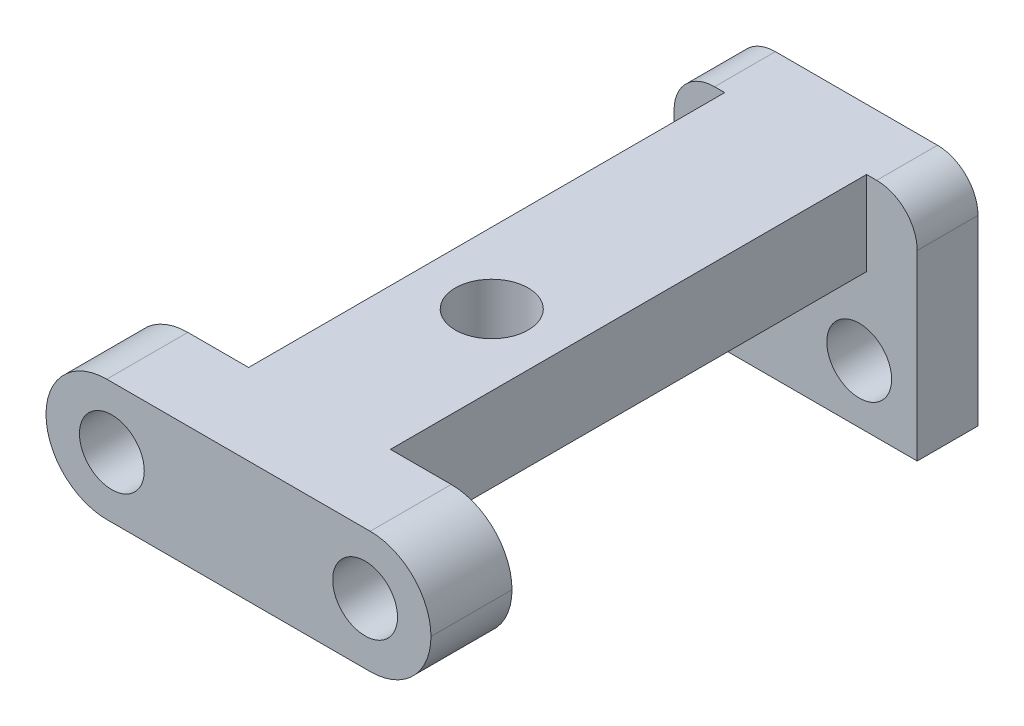
ISO-10303-21;
HEADER;
FILE_DESCRIPTION(('STEP AP214'),'2;1');
FILE_NAME('part.step','',(''),(''),'','','');
FILE_SCHEMA(('AUTOMOTIVE_DESIGN { 1 0 10303 214 1 1 1 1 }'));
ENDSEC;
DATA;
#1=APPLICATION_CONTEXT('core data for automotive mechanical design processes');
#2=APPLICATION_PROTOCOL_DEFINITION('international standard','automotive_design',2000,#1);
#3=PRODUCT_CONTEXT('',#1,'mechanical');
#4=PRODUCT('Part','Part','',(#3));
#5=PRODUCT_RELATED_PRODUCT_CATEGORY('part','',(#4));
#6=PRODUCT_DEFINITION_FORMATION('','',#4);
#7=PRODUCT_DEFINITION_CONTEXT('part definition',#1,'design');
#8=PRODUCT_DEFINITION('design','',#6,#7);
#9=PRODUCT_DEFINITION_SHAPE('','',#8);
#10=(LENGTH_UNIT() NAMED_UNIT(*) SI_UNIT(.MILLI.,.METRE.));
#11=(NAMED_UNIT(*) PLANE_ANGLE_UNIT() SI_UNIT($,.RADIAN.));
#12=(NAMED_UNIT(*) SI_UNIT($,.STERADIAN.) SOLID_ANGLE_UNIT());
#13=UNCERTAINTY_MEASURE_WITH_UNIT(LENGTH_MEASURE(1.E-05),#10,'distance_accuracy_value','');
#14=(GEOMETRIC_REPRESENTATION_CONTEXT(3) GLOBAL_UNCERTAINTY_ASSIGNED_CONTEXT((#13)) GLOBAL_UNIT_ASSIGNED_CONTEXT((#10,
#11,#12)) REPRESENTATION_CONTEXT('',''));
#15=CARTESIAN_POINT('',(0.,0.,0.));
#16=DIRECTION('',(0.,0.,1.));
#17=DIRECTION('',(1.,0.,0.));
#18=AXIS2_PLACEMENT_3D('',#15,#16,#17);
#19=CARTESIAN_POINT('',(0.,0.,27.5));
#20=DIRECTION('',(0.,0.,-1.));
#21=DIRECTION('',(-1.,0.,0.));
#22=AXIS2_PLACEMENT_3D('',#19,#20,#21);
#23=CYLINDRICAL_SURFACE('',#22,40.);
#24=CARTESIAN_POINT('',(0.,40.,16.8));
#25=CARTESIAN_POINT('',(-0.101051914719797,39.999999457016,16.7999955359726));
#26=CARTESIAN_POINT('',(-0.202175798413311,39.9996129659403,16.7914618501219));
#27=CARTESIAN_POINT('',(-0.401634798514854,39.9981083318101,16.7575398127747));
#28=CARTESIAN_POINT('',(-0.499966471947186,39.996989323187,16.7321315211301));
#29=CARTESIAN_POINT('',(-0.690922772210576,39.9941463282659,16.6651884248385));
#30=CARTESIAN_POINT('',(-0.783550245788738,39.9924226466609,16.6236617410828));
#31=CARTESIAN_POINT('',(-0.960494305476466,39.9885645227784,16.5256728875248));
#32=CARTESIAN_POINT('',(-1.04481286673066,39.9864301784791,16.4692142790626));
#33=CARTESIAN_POINT('',(-1.20284227269959,39.9819888780099,16.3429106077246));
#34=CARTESIAN_POINT('',(-1.27654526473791,39.9796817959582,16.2730557233464));
#35=CARTESIAN_POINT('',(-1.41118459720699,39.9751561327293,16.1219616438645));
#36=CARTESIAN_POINT('',(-1.47212042005941,39.9729375551431,16.0407219874474));
#37=CARTESIAN_POINT('',(-1.57951582618927,39.9688382334278,15.869125185014));
#38=CARTESIAN_POINT('',(-1.62596950488977,39.9669576272266,15.7787643399834));
#39=CARTESIAN_POINT('',(-1.70304402326993,39.963747792788,15.591516262423));
#40=CARTESIAN_POINT('',(-1.73366496624174,39.9624185609535,15.4946290724754));
#41=CARTESIAN_POINT('',(-1.77818466726212,39.9604624691031,15.2971487729222));
#42=CARTESIAN_POINT('',(-1.79209484484824,39.9598351294595,15.1965582425489));
#43=CARTESIAN_POINT('',(-1.80283338005946,39.9593521228803,14.9944680848602));
#44=CARTESIAN_POINT('',(-1.79966185269654,39.959496450749,14.8929684636705));
#45=CARTESIAN_POINT('',(-1.77633654044452,39.9605400576052,14.6920188889247));
#46=CARTESIAN_POINT('',(-1.75619509042125,39.9614387882409,14.5925675003516));
#47=CARTESIAN_POINT('',(-1.69952078232798,39.9638890360555,14.3984588593437));
#48=CARTESIAN_POINT('',(-1.66298786481739,39.9654405556016,14.3038016242955));
#49=CARTESIAN_POINT('',(-1.57455354522525,39.9690221348509,14.1219285069495));
#50=CARTESIAN_POINT('',(-1.52264651025507,39.9710523698939,14.0347153671905));
#51=CARTESIAN_POINT('',(-1.40494152334163,39.9753623609457,13.8702361117621));
#52=CARTESIAN_POINT('',(-1.33914349303119,39.9776421183622,13.7929700522138));
#53=CARTESIAN_POINT('',(-1.19545462518403,39.9821966281058,13.6505064515006));
#54=CARTESIAN_POINT('',(-1.11755310311077,39.9844713741921,13.5853196860778));
#55=CARTESIAN_POINT('',(-0.951906176697614,39.9887575108181,13.4689480977805));
#56=CARTESIAN_POINT('',(-0.864160770218331,39.9907689013005,13.417763277949));
#57=CARTESIAN_POINT('',(-0.68131062802147,39.9943016941348,13.3308496092599));
#58=CARTESIAN_POINT('',(-0.586205718526382,39.995823084912,13.295121125499));
#59=CARTESIAN_POINT('',(-0.391339011752936,39.9982042315168,13.2401413230687));
#60=CARTESIAN_POINT('',(-0.291577242751363,39.9990639913611,13.2208899043631));
#61=CARTESIAN_POINT('',(-0.0903222591607367,40.0000244583365,13.1994239671856));
#62=CARTESIAN_POINT('',(0.0111693624451952,40.0001258296116,13.1971945419987));
#63=CARTESIAN_POINT('',(0.213085316249135,39.9995598562656,13.2097969916761));
#64=CARTESIAN_POINT('',(0.313509651294398,39.9988925136958,13.2246288210137));
#65=CARTESIAN_POINT('',(0.51039865003854,39.9968647182223,13.2709204213613));
#66=CARTESIAN_POINT('',(0.606864914556497,39.9955045485747,13.3023733971616));
#67=CARTESIAN_POINT('',(0.793148719896412,39.9922442747655,13.381007567835));
#68=CARTESIAN_POINT('',(0.882966229794925,39.9903441680928,13.4281888358548));
#69=CARTESIAN_POINT('',(1.05347143760494,39.9862162054273,13.5369785221013));
#70=CARTESIAN_POINT('',(1.13415274653935,39.9839881225533,13.5985969449874));
#71=CARTESIAN_POINT('',(1.2840310900569,39.9794559437157,13.7344971825781));
#72=CARTESIAN_POINT('',(1.35322806417522,39.9771518473521,13.8087790639513));
#73=CARTESIAN_POINT('',(1.47822356315217,39.9727254615055,13.9679616872846));
#74=CARTESIAN_POINT('',(1.53401245170323,39.9706033034809,14.0528700001431));
#75=CARTESIAN_POINT('',(1.63054228552971,39.9667821511794,14.230856911139));
#76=CARTESIAN_POINT('',(1.67128328697316,39.965083155323,14.3239354787784));
#77=CARTESIAN_POINT('',(1.73654402350732,39.9623008442568,14.5155848688947));
#78=CARTESIAN_POINT('',(1.76106992850842,39.9612172948893,14.6141535868499));
#79=CARTESIAN_POINT('',(1.79322446244897,39.9597873997389,14.8140148099575));
#80=CARTESIAN_POINT('',(1.80085316318999,39.9594410508234,14.9153073035338));
#81=CARTESIAN_POINT('',(1.79899602386849,39.9595246946806,15.1176447576157));
#82=CARTESIAN_POINT('',(1.78952534925552,39.9599539995255,15.2186898579528));
#83=CARTESIAN_POINT('',(1.75376960904838,39.9615391099764,15.4177540425272));
#84=CARTESIAN_POINT('',(1.72748451096948,39.962694916986,15.5157731209178));
#85=CARTESIAN_POINT('',(1.65884899681329,39.9656026088208,15.7060064721643));
#86=CARTESIAN_POINT('',(1.61649840541597,39.967354500151,15.7982206816598));
#87=CARTESIAN_POINT('',(1.51693704719745,39.9712568355617,15.9742302384845));
#88=CARTESIAN_POINT('',(1.45972676043274,39.9734072667663,16.0580258576629));
#89=CARTESIAN_POINT('',(1.33201693457347,39.9778664386974,16.2148945431379));
#90=CARTESIAN_POINT('',(1.26150708482,39.9801753013604,16.2879592114304));
#91=CARTESIAN_POINT('',(1.10920151908198,39.9846903629391,16.4212363730933));
#92=CARTESIAN_POINT('',(1.02740302565458,39.98689653641,16.4814456942365));
#93=CARTESIAN_POINT('',(0.854787564323086,39.9909588898273,16.5873258186714));
#94=CARTESIAN_POINT('',(0.763962853833083,39.9928147652666,16.6329839964611));
#95=CARTESIAN_POINT('',(0.575997093234725,39.9959626189959,16.7083491777296));
#96=CARTESIAN_POINT('',(0.478863678791842,39.9972552648908,16.7380750756629));
#97=CARTESIAN_POINT('',(0.317603112098561,39.9987880385604,16.7729107767247));
#98=CARTESIAN_POINT('',(0.254521149372205,39.9992405342942,16.7830563219923));
#99=CARTESIAN_POINT('',(0.127635696366364,39.9998466864074,16.7966023412402));
#100=CARTESIAN_POINT('',(0.0638322065794623,40.0000003429907,16.800002819825));
#101=CARTESIAN_POINT('',(0.,40.,16.8));
#102=B_SPLINE_CURVE_WITH_KNOTS('',3,(#24,#25,#26,#27,#28,#29,#30,#31,#32,#33,#34,#35,#36,#37,
#38,#39,#40,#41,#42,#43,#44,#45,#46,#47,#48,#49,#50,#51,#52,#53,#54,#55,#56,#57,#58,#59,#60,#61,
#62,#63,#64,#65,#66,#67,#68,#69,#70,#71,#72,#73,#74,#75,#76,#77,#78,#79,#80,#81,#82,#83,#84,#85,
#86,#87,#88,#89,#90,#91,#92,#93,#94,#95,#96,#97,#98,#99,#100,#101),.UNSPECIFIED.,.T.,.F.,(4,2,2,
2,2,2,2,2,2,2,2,2,2,2,2,2,2,2,2,2,2,2,2,2,2,2,2,2,2,2,2,2,2,2,2,2,2,2,4),(0.,0.30292273744918,
0.606204066807213,0.909332792580044,1.21238928570471,1.5156688205583,1.81896064792217,
2.12237597046258,2.42578931350836,2.72899519660173,3.03219903819725,3.33518268106364,
3.63816742265226,3.9412633117565,4.24436091084618,4.54772761019765,4.85109437548061,
5.15446830624969,5.45784039515009,5.76094678071034,6.06405235745487,6.36703411155592,
6.67001727474059,6.97321102345696,7.27640636843294,7.57981897072887,7.88323044048949,
8.18652639440096,8.48982105950921,8.79284686446018,9.09587325484547,9.39890295220195,
9.70192286111533,10.0051786629694,10.3085092109409,10.6121022358275,10.915334421674,
11.1066839869744,11.2980334216496),.UNSPECIFIED.);
#103=CARTESIAN_POINT('',(0.,40.,16.8));
#104=VERTEX_POINT('',#103);
#105=EDGE_CURVE('E257',#104,#104,#102,.T.);
#106=ORIENTED_EDGE('',*,*,#105,.F.);
#107=EDGE_LOOP('',(#106));
#108=FACE_BOUND('',#107,.T.);
#109=DIRECTION('',(0.,0.,-1.));
#110=VECTOR('',#109,1.);
#111=CARTESIAN_POINT('',(3.5,39.8465807817936,27.5));
#112=LINE('',#111,#110);
#113=CARTESIAN_POINT('',(3.5,39.8465807817936,23.5));
#114=VERTEX_POINT('',#113);
#115=CARTESIAN_POINT('',(3.5,39.8465807817936,0.));
#116=VERTEX_POINT('',#115);
#117=EDGE_CURVE('E219',#114,#116,#112,.T.);
#118=ORIENTED_EDGE('',*,*,#117,.F.);
#119=CARTESIAN_POINT('',(0.,0.,23.5));
#120=DIRECTION('',(0.,0.,1.));
#121=DIRECTION('',(1.,0.,0.));
#122=AXIS2_PLACEMENT_3D('',#119,#120,#121);
#123=CIRCLE('',#122,40.);
#124=CARTESIAN_POINT('',(-3.5,39.8465807817936,23.5));
#125=VERTEX_POINT('',#124);
#126=EDGE_CURVE('E345',#114,#125,#123,.T.);
#127=ORIENTED_EDGE('',*,*,#126,.T.);
#128=DIRECTION('',(0.,0.,-1.));
#129=VECTOR('',#128,1.);
#130=CARTESIAN_POINT('',(-3.5,39.8465807817936,27.5));
#131=LINE('',#130,#129);
#132=CARTESIAN_POINT('',(-3.5,39.8465807817936,0.));
#133=VERTEX_POINT('',#132);
#134=EDGE_CURVE('E204',#125,#133,#131,.T.);
#135=ORIENTED_EDGE('',*,*,#134,.T.);
#136=CARTESIAN_POINT('',(0.,0.,0.));
#137=DIRECTION('',(0.,0.,1.));
#138=DIRECTION('',(1.,0.,0.));
#139=AXIS2_PLACEMENT_3D('',#136,#137,#138);
#140=CIRCLE('',#139,40.);
#141=EDGE_CURVE('E170',#116,#133,#140,.T.);
#142=ORIENTED_EDGE('',*,*,#141,.F.);
#143=EDGE_LOOP('',(#118,#127,#135,#142));
#144=FACE_BOUND('',#143,.T.);
#145=ADVANCED_FACE('F37',(#108,#144),#23,.F.);
#146=CARTESIAN_POINT('',(3.50000000000001,0.,27.5));
#147=DIRECTION('',(1.,0.,0.));
#148=DIRECTION('',(0.,1.,0.));
#149=AXIS2_PLACEMENT_3D('',#146,#147,#148);
#150=PLANE('',#149);
#151=DIRECTION('',(0.,0.,-1.));
#152=VECTOR('',#151,1.);
#153=CARTESIAN_POINT('',(3.5,44.,27.5));
#154=LINE('',#153,#152);
#155=CARTESIAN_POINT('',(3.5,44.,23.5));
#156=VERTEX_POINT('',#155);
#157=CARTESIAN_POINT('',(3.5,44.,0.));
#158=VERTEX_POINT('',#157);
#159=EDGE_CURVE('E216',#156,#158,#154,.T.);
#160=ORIENTED_EDGE('',*,*,#159,.F.);
#161=DIRECTION('',(0.,-1.,0.));
#162=VECTOR('',#161,1.);
#163=CARTESIAN_POINT('',(3.50000000000001,0.,23.5));
#164=LINE('',#163,#162);
#165=EDGE_CURVE('E187',#156,#114,#164,.T.);
#166=ORIENTED_EDGE('',*,*,#165,.T.);
#167=ORIENTED_EDGE('',*,*,#117,.T.);
#168=DIRECTION('',(0.,-1.,0.));
#169=VECTOR('',#168,1.);
#170=CARTESIAN_POINT('',(3.50000000000001,0.,0.));
#171=LINE('',#170,#169);
#172=EDGE_CURVE('E208',#158,#116,#171,.T.);
#173=ORIENTED_EDGE('',*,*,#172,.F.);
#174=EDGE_LOOP('',(#160,#166,#167,#173));
#175=FACE_BOUND('',#174,.T.);
#176=ADVANCED_FACE('F323',(#175),#150,.T.);
#177=CARTESIAN_POINT('',(-3.5,0.,27.5));
#178=DIRECTION('',(-1.,0.,0.));
#179=DIRECTION('',(0.,0.,1.));
#180=AXIS2_PLACEMENT_3D('',#177,#178,#179);
#181=PLANE('',#180);
#182=ORIENTED_EDGE('',*,*,#134,.F.);
#183=DIRECTION('',(0.,1.,0.));
#184=VECTOR('',#183,1.);
#185=CARTESIAN_POINT('',(-3.5,0.,23.5));
#186=LINE('',#185,#184);
#187=CARTESIAN_POINT('',(-3.5,44.,23.5));
#188=VERTEX_POINT('',#187);
#189=EDGE_CURVE('E221',#125,#188,#186,.T.);
#190=ORIENTED_EDGE('',*,*,#189,.T.);
#191=DIRECTION('',(0.,0.,-1.));
#192=VECTOR('',#191,1.);
#193=CARTESIAN_POINT('',(-3.5,44.,27.5));
#194=LINE('',#193,#192);
#195=CARTESIAN_POINT('',(-3.5,44.,0.));
#196=VERTEX_POINT('',#195);
#197=EDGE_CURVE('E214',#188,#196,#194,.T.);
#198=ORIENTED_EDGE('',*,*,#197,.T.);
#199=DIRECTION('',(0.,1.,0.));
#200=VECTOR('',#199,1.);
#201=CARTESIAN_POINT('',(-3.5,0.,0.));
#202=LINE('',#201,#200);
#203=EDGE_CURVE('E205',#133,#196,#202,.T.);
#204=ORIENTED_EDGE('',*,*,#203,.F.);
#205=EDGE_LOOP('',(#182,#190,#198,#204));
#206=FACE_BOUND('',#205,.T.);
#207=ADVANCED_FACE('F320',(#206),#181,.T.);
#208=CARTESIAN_POINT('',(0.,44.,27.5));
#209=DIRECTION('',(0.,1.,0.));
#210=DIRECTION('',(0.,0.,1.));
#211=AXIS2_PLACEMENT_3D('',#208,#209,#210);
#212=PLANE('',#211);
#213=CARTESIAN_POINT('',(0.,44.,15.));
#214=DIRECTION('',(0.,1.,0.));
#215=DIRECTION('',(0.,0.,1.));
#216=AXIS2_PLACEMENT_3D('',#213,#214,#215);
#217=CIRCLE('',#216,1.8);
#218=CARTESIAN_POINT('',(0.,44.,16.8));
#219=VERTEX_POINT('',#218);
#220=EDGE_CURVE('E265',#219,#219,#217,.T.);
#221=ORIENTED_EDGE('',*,*,#220,.F.);
#222=EDGE_LOOP('',(#221));
#223=FACE_BOUND('',#222,.T.);
#224=DIRECTION('',(-1.,0.,0.));
#225=VECTOR('',#224,1.);
#226=CARTESIAN_POINT('',(0.,44.,0.));
#227=LINE('',#226,#225);
#228=CARTESIAN_POINT('',(4.,44.,0.));
#229=VERTEX_POINT('',#228);
#230=EDGE_CURVE('E188',#229,#158,#227,.T.);
#231=ORIENTED_EDGE('',*,*,#230,.F.);
#232=DIRECTION('',(0.,0.,1.));
#233=VECTOR('',#232,1.);
#234=CARTESIAN_POINT('',(4.,44.,-3.));
#235=LINE('',#234,#233);
#236=CARTESIAN_POINT('',(4.,44.,-3.));
#237=VERTEX_POINT('',#236);
#238=EDGE_CURVE('E356',#229,#237,#235,.F.);
#239=ORIENTED_EDGE('',*,*,#238,.T.);
#240=DIRECTION('',(-1.,0.,0.));
#241=VECTOR('',#240,1.);
#242=CARTESIAN_POINT('',(0.,44.,-3.));
#243=LINE('',#242,#241);
#244=CARTESIAN_POINT('',(-4.,44.,-3.));
#245=VERTEX_POINT('',#244);
#246=EDGE_CURVE('E160',#237,#245,#243,.T.);
#247=ORIENTED_EDGE('',*,*,#246,.T.);
#248=DIRECTION('',(0.,0.,1.));
#249=VECTOR('',#248,1.);
#250=CARTESIAN_POINT('',(-4.,44.,27.5));
#251=LINE('',#250,#249);
#252=CARTESIAN_POINT('',(-4.,44.,0.));
#253=VERTEX_POINT('',#252);
#254=EDGE_CURVE('E353',#245,#253,#251,.T.);
#255=ORIENTED_EDGE('',*,*,#254,.T.);
#256=EDGE_CURVE('E186',#196,#253,#227,.T.);
#257=ORIENTED_EDGE('',*,*,#256,.F.);
#258=ORIENTED_EDGE('',*,*,#197,.F.);
#259=DIRECTION('',(-1.,0.,0.));
#260=VECTOR('',#259,1.);
#261=CARTESIAN_POINT('',(-9.5,44.,23.5));
#262=LINE('',#261,#260);
#263=CARTESIAN_POINT('',(-6.5,44.,23.5));
#264=VERTEX_POINT('',#263);
#265=EDGE_CURVE('E394',#188,#264,#262,.T.);
#266=ORIENTED_EDGE('',*,*,#265,.T.);
#267=DIRECTION('',(0.,0.,1.));
#268=VECTOR('',#267,1.);
#269=CARTESIAN_POINT('',(-6.5,44.,27.5));
#270=LINE('',#269,#268);
#271=CARTESIAN_POINT('',(-6.5,44.,27.5));
#272=VERTEX_POINT('',#271);
#273=EDGE_CURVE('E245',#264,#272,#270,.T.);
#274=ORIENTED_EDGE('',*,*,#273,.T.);
#275=DIRECTION('',(1.,0.,0.));
#276=VECTOR('',#275,1.);
#277=CARTESIAN_POINT('',(0.,44.,27.5));
#278=LINE('',#277,#276);
#279=CARTESIAN_POINT('',(6.5,44.,27.5));
#280=VERTEX_POINT('',#279);
#281=EDGE_CURVE('E201',#272,#280,#278,.T.);
#282=ORIENTED_EDGE('',*,*,#281,.T.);
#283=DIRECTION('',(0.,0.,1.));
#284=VECTOR('',#283,1.);
#285=CARTESIAN_POINT('',(6.5,44.,27.5));
#286=LINE('',#285,#284);
#287=CARTESIAN_POINT('',(6.5,44.,23.5));
#288=VERTEX_POINT('',#287);
#289=EDGE_CURVE('E247',#280,#288,#286,.F.);
#290=ORIENTED_EDGE('',*,*,#289,.T.);
#291=EDGE_CURVE('E342',#288,#156,#262,.T.);
#292=ORIENTED_EDGE('',*,*,#291,.T.);
#293=ORIENTED_EDGE('',*,*,#159,.T.);
#294=EDGE_LOOP('',(#231,#239,#247,#255,#257,#258,#266,#274,#282,#290,#292,#293));
#295=FACE_BOUND('',#294,.T.);
#296=ADVANCED_FACE('F318',(#223,#295),#212,.T.);
#297=CARTESIAN_POINT('',(0.,0.,27.5));
#298=DIRECTION('',(0.,0.,1.));
#299=DIRECTION('',(1.,0.,0.));
#300=AXIS2_PLACEMENT_3D('',#297,#298,#299);
#301=PLANE('',#300);
#302=CARTESIAN_POINT('',(-6.25,41.,27.5));
#303=DIRECTION('',(0.,0.,1.));
#304=DIRECTION('',(1.,0.,0.));
#305=AXIS2_PLACEMENT_3D('',#302,#303,#304);
#306=CIRCLE('',#305,1.6);
#307=CARTESIAN_POINT('',(-4.65,41.,27.5));
#308=VERTEX_POINT('',#307);
#309=EDGE_CURVE('E253',#308,#308,#306,.T.);
#310=ORIENTED_EDGE('',*,*,#309,.F.);
#311=EDGE_LOOP('',(#310));
#312=FACE_BOUND('',#311,.T.);
#313=CARTESIAN_POINT('',(6.25,41.,27.5));
#314=DIRECTION('',(0.,0.,1.));
#315=DIRECTION('',(1.,0.,0.));
#316=AXIS2_PLACEMENT_3D('',#313,#314,#315);
#317=CIRCLE('',#316,1.6);
#318=CARTESIAN_POINT('',(7.84999999999999,41.,27.5));
#319=VERTEX_POINT('',#318);
#320=EDGE_CURVE('E418',#319,#319,#317,.T.);
#321=ORIENTED_EDGE('',*,*,#320,.F.);
#322=EDGE_LOOP('',(#321));
#323=FACE_BOUND('',#322,.T.);
#324=DIRECTION('',(1.,0.,0.));
#325=VECTOR('',#324,1.);
#326=CARTESIAN_POINT('',(-9.5,38.,27.5));
#327=LINE('',#326,#325);
#328=CARTESIAN_POINT('',(-6.5,38.,27.5));
#329=VERTEX_POINT('',#328);
#330=CARTESIAN_POINT('',(6.5,38.,27.5));
#331=VERTEX_POINT('',#330);
#332=EDGE_CURVE('E395',#329,#331,#327,.T.);
#333=ORIENTED_EDGE('',*,*,#332,.T.);
#334=CARTESIAN_POINT('',(6.5,41.,27.5));
#335=DIRECTION('',(0.,0.,1.));
#336=DIRECTION('',(1.,0.,0.));
#337=AXIS2_PLACEMENT_3D('',#334,#335,#336);
#338=CIRCLE('',#337,3.);
#339=CARTESIAN_POINT('',(9.49999999999999,41.,27.5));
#340=VERTEX_POINT('',#339);
#341=EDGE_CURVE('E235',#331,#340,#338,.T.);
#342=ORIENTED_EDGE('',*,*,#341,.T.);
#343=CARTESIAN_POINT('',(6.5,41.,27.5));
#344=DIRECTION('',(0.,0.,1.));
#345=DIRECTION('',(1.,0.,0.));
#346=AXIS2_PLACEMENT_3D('',#343,#344,#345);
#347=CIRCLE('',#346,3.);
#348=EDGE_CURVE('E233',#340,#280,#347,.T.);
#349=ORIENTED_EDGE('',*,*,#348,.T.);
#350=ORIENTED_EDGE('',*,*,#281,.F.);
#351=CARTESIAN_POINT('',(-6.5,41.,27.5));
#352=DIRECTION('',(0.,0.,1.));
#353=DIRECTION('',(1.,0.,0.));
#354=AXIS2_PLACEMENT_3D('',#351,#352,#353);
#355=CIRCLE('',#354,3.);
#356=CARTESIAN_POINT('',(-9.5,41.,27.5));
#357=VERTEX_POINT('',#356);
#358=EDGE_CURVE('E229',#272,#357,#355,.T.);
#359=ORIENTED_EDGE('',*,*,#358,.T.);
#360=CARTESIAN_POINT('',(-6.5,41.,27.5));
#361=DIRECTION('',(0.,0.,1.));
#362=DIRECTION('',(1.,0.,0.));
#363=AXIS2_PLACEMENT_3D('',#360,#361,#362);
#364=CIRCLE('',#363,3.);
#365=EDGE_CURVE('E231',#357,#329,#364,.T.);
#366=ORIENTED_EDGE('',*,*,#365,.T.);
#367=EDGE_LOOP('',(#333,#342,#349,#350,#359,#366));
#368=FACE_BOUND('',#367,.T.);
#369=ADVANCED_FACE('F301',(#312,#323,#368),#301,.T.);
#370=CARTESIAN_POINT('',(0.,0.,0.));
#371=DIRECTION('',(0.,0.,-1.));
#372=DIRECTION('',(-1.,0.,0.));
#373=AXIS2_PLACEMENT_3D('',#370,#371,#372);
#374=PLANE('',#373);
#375=CARTESIAN_POINT('',(-3.1376067389157,35.8630091313028,0.));
#376=DIRECTION('',(0.,0.,-1.));
#377=DIRECTION('',(-1.,0.,0.));
#378=AXIS2_PLACEMENT_3D('',#375,#376,#377);
#379=CIRCLE('',#378,1.59999999999999);
#380=CARTESIAN_POINT('',(-4.73760673891569,35.8630091313028,0.));
#381=VERTEX_POINT('',#380);
#382=EDGE_CURVE('E193',#381,#381,#379,.T.);
#383=ORIENTED_EDGE('',*,*,#382,.T.);
#384=EDGE_LOOP('',(#383));
#385=FACE_BOUND('',#384,.T.);
#386=CARTESIAN_POINT('',(3.1376067389157,35.8630091313028,0.));
#387=DIRECTION('',(0.,0.,-1.));
#388=DIRECTION('',(-1.,0.,0.));
#389=AXIS2_PLACEMENT_3D('',#386,#387,#388);
#390=CIRCLE('',#389,1.6);
#391=CARTESIAN_POINT('',(1.5376067389157,35.8630091313028,0.));
#392=VERTEX_POINT('',#391);
#393=EDGE_CURVE('E196',#392,#392,#390,.T.);
#394=ORIENTED_EDGE('',*,*,#393,.T.);
#395=EDGE_LOOP('',(#394));
#396=FACE_BOUND('',#395,.T.);
#397=DIRECTION('',(0.,-1.,0.));
#398=VECTOR('',#397,1.);
#399=CARTESIAN_POINT('',(5.99999999999999,0.,0.));
#400=LINE('',#399,#398);
#401=CARTESIAN_POINT('',(6.,42.,0.));
#402=VERTEX_POINT('',#401);
#403=CARTESIAN_POINT('',(6.,33.,0.));
#404=VERTEX_POINT('',#403);
#405=EDGE_CURVE('E166',#402,#404,#400,.T.);
#406=ORIENTED_EDGE('',*,*,#405,.F.);
#407=CARTESIAN_POINT('',(4.,42.,0.));
#408=DIRECTION('',(0.,0.,-1.));
#409=DIRECTION('',(-1.,0.,0.));
#410=AXIS2_PLACEMENT_3D('',#407,#408,#409);
#411=CIRCLE('',#410,2.);
#412=EDGE_CURVE('E359',#402,#229,#411,.F.);
#413=ORIENTED_EDGE('',*,*,#412,.T.);
#414=ORIENTED_EDGE('',*,*,#230,.T.);
#415=ORIENTED_EDGE('',*,*,#172,.T.);
#416=ORIENTED_EDGE('',*,*,#141,.T.);
#417=ORIENTED_EDGE('',*,*,#203,.T.);
#418=ORIENTED_EDGE('',*,*,#256,.T.);
#419=CARTESIAN_POINT('',(-4.,42.,0.));
#420=DIRECTION('',(0.,0.,-1.));
#421=DIRECTION('',(-1.,0.,0.));
#422=AXIS2_PLACEMENT_3D('',#419,#420,#421);
#423=CIRCLE('',#422,2.);
#424=CARTESIAN_POINT('',(-6.,42.,0.));
#425=VERTEX_POINT('',#424);
#426=EDGE_CURVE('E358',#253,#425,#423,.F.);
#427=ORIENTED_EDGE('',*,*,#426,.T.);
#428=DIRECTION('',(0.,-1.,0.));
#429=VECTOR('',#428,1.);
#430=CARTESIAN_POINT('',(-6.,0.,0.));
#431=LINE('',#430,#429);
#432=CARTESIAN_POINT('',(-6.,33.,0.));
#433=VERTEX_POINT('',#432);
#434=EDGE_CURVE('E184',#425,#433,#431,.T.);
#435=ORIENTED_EDGE('',*,*,#434,.T.);
#436=DIRECTION('',(-1.,0.,0.));
#437=VECTOR('',#436,1.);
#438=CARTESIAN_POINT('',(0.,33.,0.));
#439=LINE('',#438,#437);
#440=EDGE_CURVE('E191',#404,#433,#439,.T.);
#441=ORIENTED_EDGE('',*,*,#440,.F.);
#442=EDGE_LOOP('',(#406,#413,#414,#415,#416,#417,#418,#427,#435,#441));
#443=FACE_BOUND('',#442,.T.);
#444=ADVANCED_FACE('F297',(#385,#396,#443),#374,.F.);
#445=CARTESIAN_POINT('',(-6.,0.,-3.));
#446=DIRECTION('',(-1.,0.,0.));
#447=DIRECTION('',(0.,-1.,0.));
#448=AXIS2_PLACEMENT_3D('',#445,#446,#447);
#449=PLANE('',#448);
#450=ORIENTED_EDGE('',*,*,#434,.F.);
#451=DIRECTION('',(0.,0.,1.));
#452=VECTOR('',#451,1.);
#453=CARTESIAN_POINT('',(-6.,42.,-3.));
#454=LINE('',#453,#452);
#455=CARTESIAN_POINT('',(-6.,42.,-3.));
#456=VERTEX_POINT('',#455);
#457=EDGE_CURVE('E11',#425,#456,#454,.F.);
#458=ORIENTED_EDGE('',*,*,#457,.T.);
#459=DIRECTION('',(0.,-1.,0.));
#460=VECTOR('',#459,1.);
#461=CARTESIAN_POINT('',(-6.,0.,-3.));
#462=LINE('',#461,#460);
#463=CARTESIAN_POINT('',(-6.,33.,-3.));
#464=VERTEX_POINT('',#463);
#465=EDGE_CURVE('E199',#456,#464,#462,.T.);
#466=ORIENTED_EDGE('',*,*,#465,.T.);
#467=DIRECTION('',(0.,0.,1.));
#468=VECTOR('',#467,1.);
#469=CARTESIAN_POINT('',(-6.,33.,-3.));
#470=LINE('',#469,#468);
#471=EDGE_CURVE('E171',#464,#433,#470,.T.);
#472=ORIENTED_EDGE('',*,*,#471,.T.);
#473=EDGE_LOOP('',(#450,#458,#466,#472));
#474=FACE_BOUND('',#473,.T.);
#475=ADVANCED_FACE('F300',(#474),#449,.T.);
#476=CARTESIAN_POINT('',(5.99999999999999,0.,-3.));
#477=DIRECTION('',(-1.,0.,0.));
#478=DIRECTION('',(0.,-1.,0.));
#479=AXIS2_PLACEMENT_3D('',#476,#477,#478);
#480=PLANE('',#479);
#481=DIRECTION('',(0.,-1.,0.));
#482=VECTOR('',#481,1.);
#483=CARTESIAN_POINT('',(5.99999999999999,0.,-3.));
#484=LINE('',#483,#482);
#485=CARTESIAN_POINT('',(6.,42.,-3.));
#486=VERTEX_POINT('',#485);
#487=CARTESIAN_POINT('',(6.,33.,-3.));
#488=VERTEX_POINT('',#487);
#489=EDGE_CURVE('E149',#486,#488,#484,.T.);
#490=ORIENTED_EDGE('',*,*,#489,.F.);
#491=DIRECTION('',(0.,0.,1.));
#492=VECTOR('',#491,1.);
#493=CARTESIAN_POINT('',(6.,42.,0.));
#494=LINE('',#493,#492);
#495=EDGE_CURVE('E249',#486,#402,#494,.T.);
#496=ORIENTED_EDGE('',*,*,#495,.T.);
#497=ORIENTED_EDGE('',*,*,#405,.T.);
#498=DIRECTION('',(0.,0.,1.));
#499=VECTOR('',#498,1.);
#500=CARTESIAN_POINT('',(6.,33.,-3.));
#501=LINE('',#500,#499);
#502=EDGE_CURVE('E163',#488,#404,#501,.T.);
#503=ORIENTED_EDGE('',*,*,#502,.F.);
#504=EDGE_LOOP('',(#490,#496,#497,#503));
#505=FACE_BOUND('',#504,.T.);
#506=ADVANCED_FACE('F164',(#505),#480,.F.);
#507=CARTESIAN_POINT('',(-3.1376067389157,35.8630091313028,-3.));
#508=DIRECTION('',(0.,0.,1.));
#509=DIRECTION('',(1.,0.,0.));
#510=AXIS2_PLACEMENT_3D('',#507,#508,#509);
#511=CYLINDRICAL_SURFACE('',#510,1.59999999999999);
#512=CARTESIAN_POINT('',(-3.1376067389157,35.8630091313028,-3.));
#513=DIRECTION('',(0.,0.,-1.));
#514=DIRECTION('',(-1.,0.,0.));
#515=AXIS2_PLACEMENT_3D('',#512,#513,#514);
#516=CIRCLE('',#515,1.59999999999999);
#517=CARTESIAN_POINT('',(-4.73760673891569,35.8630091313028,-3.));
#518=VERTEX_POINT('',#517);
#519=EDGE_CURVE('E175',#518,#518,#516,.T.);
#520=ORIENTED_EDGE('',*,*,#519,.T.);
#521=EDGE_LOOP('',(#520));
#522=FACE_BOUND('',#521,.T.);
#523=ORIENTED_EDGE('',*,*,#382,.F.);
#524=EDGE_LOOP('',(#523));
#525=FACE_BOUND('',#524,.T.);
#526=ADVANCED_FACE('F306',(#522,#525),#511,.F.);
#527=CARTESIAN_POINT('',(0.,33.,-3.));
#528=DIRECTION('',(0.,1.,0.));
#529=DIRECTION('',(0.,0.,1.));
#530=AXIS2_PLACEMENT_3D('',#527,#528,#529);
#531=PLANE('',#530);
#532=ORIENTED_EDGE('',*,*,#440,.T.);
#533=ORIENTED_EDGE('',*,*,#471,.F.);
#534=DIRECTION('',(-1.,0.,0.));
#535=VECTOR('',#534,1.);
#536=CARTESIAN_POINT('',(0.,33.,-3.));
#537=LINE('',#536,#535);
#538=EDGE_CURVE('E154',#488,#464,#537,.T.);
#539=ORIENTED_EDGE('',*,*,#538,.F.);
#540=ORIENTED_EDGE('',*,*,#502,.T.);
#541=EDGE_LOOP('',(#532,#533,#539,#540));
#542=FACE_BOUND('',#541,.T.);
#543=ADVANCED_FACE('F173',(#542),#531,.F.);
#544=CARTESIAN_POINT('',(3.1376067389157,35.8630091313028,-3.));
#545=DIRECTION('',(0.,0.,1.));
#546=DIRECTION('',(1.,0.,0.));
#547=AXIS2_PLACEMENT_3D('',#544,#545,#546);
#548=CYLINDRICAL_SURFACE('',#547,1.6);
#549=CARTESIAN_POINT('',(3.1376067389157,35.8630091313028,-3.));
#550=DIRECTION('',(0.,0.,-1.));
#551=DIRECTION('',(-1.,0.,0.));
#552=AXIS2_PLACEMENT_3D('',#549,#550,#551);
#553=CIRCLE('',#552,1.6);
#554=CARTESIAN_POINT('',(1.5376067389157,35.8630091313028,-3.));
#555=VERTEX_POINT('',#554);
#556=EDGE_CURVE('E178',#555,#555,#553,.T.);
#557=ORIENTED_EDGE('',*,*,#556,.T.);
#558=EDGE_LOOP('',(#557));
#559=FACE_BOUND('',#558,.T.);
#560=ORIENTED_EDGE('',*,*,#393,.F.);
#561=EDGE_LOOP('',(#560));
#562=FACE_BOUND('',#561,.T.);
#563=ADVANCED_FACE('F296',(#559,#562),#548,.F.);
#564=CARTESIAN_POINT('',(0.,0.,-3.));
#565=DIRECTION('',(0.,0.,-1.));
#566=DIRECTION('',(-1.,0.,0.));
#567=AXIS2_PLACEMENT_3D('',#564,#565,#566);
#568=PLANE('',#567);
#569=ORIENTED_EDGE('',*,*,#246,.F.);
#570=CARTESIAN_POINT('',(4.,42.,-3.));
#571=DIRECTION('',(0.,0.,-1.));
#572=DIRECTION('',(-1.,0.,0.));
#573=AXIS2_PLACEMENT_3D('',#570,#571,#572);
#574=CIRCLE('',#573,2.);
#575=EDGE_CURVE('E45',#237,#486,#574,.T.);
#576=ORIENTED_EDGE('',*,*,#575,.T.);
#577=ORIENTED_EDGE('',*,*,#489,.T.);
#578=ORIENTED_EDGE('',*,*,#538,.T.);
#579=ORIENTED_EDGE('',*,*,#465,.F.);
#580=CARTESIAN_POINT('',(-4.,42.,-3.));
#581=DIRECTION('',(0.,0.,-1.));
#582=DIRECTION('',(-1.,0.,0.));
#583=AXIS2_PLACEMENT_3D('',#580,#581,#582);
#584=CIRCLE('',#583,2.);
#585=EDGE_CURVE('E57',#456,#245,#584,.T.);
#586=ORIENTED_EDGE('',*,*,#585,.T.);
#587=EDGE_LOOP('',(#569,#576,#577,#578,#579,#586));
#588=FACE_BOUND('',#587,.T.);
#589=ORIENTED_EDGE('',*,*,#519,.F.);
#590=EDGE_LOOP('',(#589));
#591=FACE_BOUND('',#590,.T.);
#592=ORIENTED_EDGE('',*,*,#556,.F.);
#593=EDGE_LOOP('',(#592));
#594=FACE_BOUND('',#593,.T.);
#595=ADVANCED_FACE('F151',(#588,#591,#594),#568,.T.);
#596=CARTESIAN_POINT('',(-9.5,38.,23.5));
#597=DIRECTION('',(0.,-1.,0.));
#598=DIRECTION('',(1.,0.,0.));
#599=AXIS2_PLACEMENT_3D('',#596,#597,#598);
#600=PLANE('',#599);
#601=DIRECTION('',(1.,0.,0.));
#602=VECTOR('',#601,1.);
#603=CARTESIAN_POINT('',(-9.5,38.,23.5));
#604=LINE('',#603,#602);
#605=CARTESIAN_POINT('',(-6.5,38.,23.5));
#606=VERTEX_POINT('',#605);
#607=CARTESIAN_POINT('',(6.5,38.,23.5));
#608=VERTEX_POINT('',#607);
#609=EDGE_CURVE('E390',#606,#608,#604,.T.);
#610=ORIENTED_EDGE('',*,*,#609,.T.);
#611=DIRECTION('',(0.,0.,1.));
#612=VECTOR('',#611,1.);
#613=CARTESIAN_POINT('',(6.5,38.,23.5));
#614=LINE('',#613,#612);
#615=EDGE_CURVE('E226',#608,#331,#614,.T.);
#616=ORIENTED_EDGE('',*,*,#615,.T.);
#617=ORIENTED_EDGE('',*,*,#332,.F.);
#618=DIRECTION('',(0.,0.,1.));
#619=VECTOR('',#618,1.);
#620=CARTESIAN_POINT('',(-6.5,38.,23.5));
#621=LINE('',#620,#619);
#622=EDGE_CURVE('E223',#329,#606,#621,.F.);
#623=ORIENTED_EDGE('',*,*,#622,.T.);
#624=EDGE_LOOP('',(#610,#616,#617,#623));
#625=FACE_BOUND('',#624,.T.);
#626=ADVANCED_FACE('F289',(#625),#600,.T.);
#627=CARTESIAN_POINT('',(0.,0.,23.5));
#628=DIRECTION('',(0.,0.,1.));
#629=DIRECTION('',(1.,0.,0.));
#630=AXIS2_PLACEMENT_3D('',#627,#628,#629);
#631=PLANE('',#630);
#632=CARTESIAN_POINT('',(-6.25,41.,23.5));
#633=DIRECTION('',(0.,0.,1.));
#634=DIRECTION('',(1.,0.,0.));
#635=AXIS2_PLACEMENT_3D('',#632,#633,#634);
#636=CIRCLE('',#635,1.6);
#637=CARTESIAN_POINT('',(-4.65,41.,23.5));
#638=VERTEX_POINT('',#637);
#639=EDGE_CURVE('E421',#638,#638,#636,.T.);
#640=ORIENTED_EDGE('',*,*,#639,.T.);
#641=EDGE_LOOP('',(#640));
#642=FACE_BOUND('',#641,.T.);
#643=CARTESIAN_POINT('',(6.25,41.,23.5));
#644=DIRECTION('',(0.,0.,1.));
#645=DIRECTION('',(1.,0.,0.));
#646=AXIS2_PLACEMENT_3D('',#643,#644,#645);
#647=CIRCLE('',#646,1.6);
#648=CARTESIAN_POINT('',(7.84999999999999,41.,23.5));
#649=VERTEX_POINT('',#648);
#650=EDGE_CURVE('E399',#649,#649,#647,.T.);
#651=ORIENTED_EDGE('',*,*,#650,.T.);
#652=EDGE_LOOP('',(#651));
#653=FACE_BOUND('',#652,.T.);
#654=CARTESIAN_POINT('',(6.5,41.,23.5));
#655=DIRECTION('',(0.,0.,1.));
#656=DIRECTION('',(1.,0.,0.));
#657=AXIS2_PLACEMENT_3D('',#654,#655,#656);
#658=CIRCLE('',#657,3.);
#659=CARTESIAN_POINT('',(9.49999999999999,41.,23.5));
#660=VERTEX_POINT('',#659);
#661=EDGE_CURVE('E241',#288,#660,#658,.F.);
#662=ORIENTED_EDGE('',*,*,#661,.T.);
#663=CARTESIAN_POINT('',(6.5,41.,23.5));
#664=DIRECTION('',(0.,0.,1.));
#665=DIRECTION('',(1.,0.,0.));
#666=AXIS2_PLACEMENT_3D('',#663,#664,#665);
#667=CIRCLE('',#666,3.);
#668=EDGE_CURVE('E243',#660,#608,#667,.F.);
#669=ORIENTED_EDGE('',*,*,#668,.T.);
#670=ORIENTED_EDGE('',*,*,#609,.F.);
#671=CARTESIAN_POINT('',(-6.5,41.,23.5));
#672=DIRECTION('',(0.,0.,1.));
#673=DIRECTION('',(1.,0.,0.));
#674=AXIS2_PLACEMENT_3D('',#671,#672,#673);
#675=CIRCLE('',#674,3.);
#676=CARTESIAN_POINT('',(-9.5,41.,23.5));
#677=VERTEX_POINT('',#676);
#678=EDGE_CURVE('E239',#606,#677,#675,.F.);
#679=ORIENTED_EDGE('',*,*,#678,.T.);
#680=CARTESIAN_POINT('',(-6.5,41.,23.5));
#681=DIRECTION('',(0.,0.,1.));
#682=DIRECTION('',(1.,0.,0.));
#683=AXIS2_PLACEMENT_3D('',#680,#681,#682);
#684=CIRCLE('',#683,3.);
#685=EDGE_CURVE('E237',#677,#264,#684,.F.);
#686=ORIENTED_EDGE('',*,*,#685,.T.);
#687=ORIENTED_EDGE('',*,*,#265,.F.);
#688=ORIENTED_EDGE('',*,*,#189,.F.);
#689=ORIENTED_EDGE('',*,*,#126,.F.);
#690=ORIENTED_EDGE('',*,*,#165,.F.);
#691=ORIENTED_EDGE('',*,*,#291,.F.);
#692=EDGE_LOOP('',(#662,#669,#670,#679,#686,#687,#688,#689,#690,#691));
#693=FACE_BOUND('',#692,.T.);
#694=ADVANCED_FACE('F285',(#642,#653,#693),#631,.F.);
#695=CARTESIAN_POINT('',(6.25,41.,27.5));
#696=DIRECTION('',(0.,0.,1.));
#697=DIRECTION('',(1.,0.,0.));
#698=AXIS2_PLACEMENT_3D('',#695,#696,#697);
#699=CYLINDRICAL_SURFACE('',#698,1.6);
#700=ORIENTED_EDGE('',*,*,#650,.F.);
#701=EDGE_LOOP('',(#700));
#702=FACE_BOUND('',#701,.T.);
#703=ORIENTED_EDGE('',*,*,#320,.T.);
#704=EDGE_LOOP('',(#703));
#705=FACE_BOUND('',#704,.T.);
#706=ADVANCED_FACE('F281',(#702,#705),#699,.F.);
#707=CARTESIAN_POINT('',(-6.25,41.,27.5));
#708=DIRECTION('',(0.,0.,1.));
#709=DIRECTION('',(1.,0.,0.));
#710=AXIS2_PLACEMENT_3D('',#707,#708,#709);
#711=CYLINDRICAL_SURFACE('',#710,1.6);
#712=ORIENTED_EDGE('',*,*,#639,.F.);
#713=EDGE_LOOP('',(#712));
#714=FACE_BOUND('',#713,.T.);
#715=ORIENTED_EDGE('',*,*,#309,.T.);
#716=EDGE_LOOP('',(#715));
#717=FACE_BOUND('',#716,.T.);
#718=ADVANCED_FACE('F277',(#714,#717),#711,.F.);
#719=CARTESIAN_POINT('',(6.5,41.,23.5));
#720=DIRECTION('',(0.,0.,1.));
#721=DIRECTION('',(1.,0.,0.));
#722=AXIS2_PLACEMENT_3D('',#719,#720,#721);
#723=CYLINDRICAL_SURFACE('',#722,3.);
#724=DIRECTION('',(0.,0.,1.));
#725=VECTOR('',#724,1.);
#726=CARTESIAN_POINT('',(9.49999999999999,41.,23.5));
#727=LINE('',#726,#725);
#728=EDGE_CURVE('E250',#660,#340,#727,.T.);
#729=ORIENTED_EDGE('',*,*,#728,.F.);
#730=ORIENTED_EDGE('',*,*,#661,.F.);
#731=ORIENTED_EDGE('',*,*,#289,.F.);
#732=ORIENTED_EDGE('',*,*,#348,.F.);
#733=EDGE_LOOP('',(#729,#730,#731,#732));
#734=FACE_BOUND('',#733,.T.);
#735=ADVANCED_FACE('F280',(#734),#723,.T.);
#736=CARTESIAN_POINT('',(6.5,41.,23.5));
#737=DIRECTION('',(0.,0.,1.));
#738=DIRECTION('',(1.,0.,0.));
#739=AXIS2_PLACEMENT_3D('',#736,#737,#738);
#740=CYLINDRICAL_SURFACE('',#739,3.);
#741=ORIENTED_EDGE('',*,*,#668,.F.);
#742=ORIENTED_EDGE('',*,*,#728,.T.);
#743=ORIENTED_EDGE('',*,*,#341,.F.);
#744=ORIENTED_EDGE('',*,*,#615,.F.);
#745=EDGE_LOOP('',(#741,#742,#743,#744));
#746=FACE_BOUND('',#745,.T.);
#747=ADVANCED_FACE('F374',(#746),#740,.T.);
#748=CARTESIAN_POINT('',(-6.5,41.,27.5));
#749=DIRECTION('',(0.,0.,1.));
#750=DIRECTION('',(1.,0.,0.));
#751=AXIS2_PLACEMENT_3D('',#748,#749,#750);
#752=CYLINDRICAL_SURFACE('',#751,3.);
#753=ORIENTED_EDGE('',*,*,#273,.F.);
#754=ORIENTED_EDGE('',*,*,#685,.F.);
#755=DIRECTION('',(0.,0.,1.));
#756=VECTOR('',#755,1.);
#757=CARTESIAN_POINT('',(-9.5,41.,23.5));
#758=LINE('',#757,#756);
#759=EDGE_CURVE('E254',#357,#677,#758,.F.);
#760=ORIENTED_EDGE('',*,*,#759,.F.);
#761=ORIENTED_EDGE('',*,*,#358,.F.);
#762=EDGE_LOOP('',(#753,#754,#760,#761));
#763=FACE_BOUND('',#762,.T.);
#764=ADVANCED_FACE('F371',(#763),#752,.T.);
#765=CARTESIAN_POINT('',(-6.5,41.,23.5));
#766=DIRECTION('',(0.,0.,1.));
#767=DIRECTION('',(1.,0.,0.));
#768=AXIS2_PLACEMENT_3D('',#765,#766,#767);
#769=CYLINDRICAL_SURFACE('',#768,3.);
#770=ORIENTED_EDGE('',*,*,#678,.F.);
#771=ORIENTED_EDGE('',*,*,#622,.F.);
#772=ORIENTED_EDGE('',*,*,#365,.F.);
#773=ORIENTED_EDGE('',*,*,#759,.T.);
#774=EDGE_LOOP('',(#770,#771,#772,#773));
#775=FACE_BOUND('',#774,.T.);
#776=ADVANCED_FACE('F275',(#775),#769,.T.);
#777=CARTESIAN_POINT('',(0.,44.,15.));
#778=DIRECTION('',(0.,1.,0.));
#779=DIRECTION('',(0.,0.,1.));
#780=AXIS2_PLACEMENT_3D('',#777,#778,#779);
#781=CYLINDRICAL_SURFACE('',#780,1.8);
#782=ORIENTED_EDGE('',*,*,#105,.T.);
#783=EDGE_LOOP('',(#782));
#784=FACE_BOUND('',#783,.T.);
#785=ORIENTED_EDGE('',*,*,#220,.T.);
#786=EDGE_LOOP('',(#785));
#787=FACE_BOUND('',#786,.T.);
#788=ADVANCED_FACE('F270',(#784,#787),#781,.F.);
#789=CARTESIAN_POINT('',(4.,42.,-3.));
#790=DIRECTION('',(0.,0.,-1.));
#791=DIRECTION('',(-1.,0.,0.));
#792=AXIS2_PLACEMENT_3D('',#789,#790,#791);
#793=CYLINDRICAL_SURFACE('',#792,2.);
#794=ORIENTED_EDGE('',*,*,#575,.F.);
#795=ORIENTED_EDGE('',*,*,#238,.F.);
#796=ORIENTED_EDGE('',*,*,#412,.F.);
#797=ORIENTED_EDGE('',*,*,#495,.F.);
#798=EDGE_LOOP('',(#794,#795,#796,#797));
#799=FACE_BOUND('',#798,.T.);
#800=ADVANCED_FACE('F274',(#799),#793,.T.);
#801=CARTESIAN_POINT('',(-4.,42.,27.5));
#802=DIRECTION('',(0.,0.,1.));
#803=DIRECTION('',(1.,0.,0.));
#804=AXIS2_PLACEMENT_3D('',#801,#802,#803);
#805=CYLINDRICAL_SURFACE('',#804,2.);
#806=ORIENTED_EDGE('',*,*,#585,.F.);
#807=ORIENTED_EDGE('',*,*,#457,.F.);
#808=ORIENTED_EDGE('',*,*,#426,.F.);
#809=ORIENTED_EDGE('',*,*,#254,.F.);
#810=EDGE_LOOP('',(#806,#807,#808,#809));
#811=FACE_BOUND('',#810,.T.);
#812=ADVANCED_FACE('F39',(#811),#805,.T.);
#813=CLOSED_SHELL('',(#145,#176,#207,#296,#369,#444,#475,#506,#526,#543,#563,#595,#626,#694,
#706,#718,#735,#747,#764,#776,#788,#800,#812));
#814=MANIFOLD_SOLID_BREP('B2',#813);
#815=ADVANCED_BREP_SHAPE_REPRESENTATION('',(#18,#814),#14);
#816=SHAPE_DEFINITION_REPRESENTATION(#9,#815);
ENDSEC;
END-ISO-10303-21;
